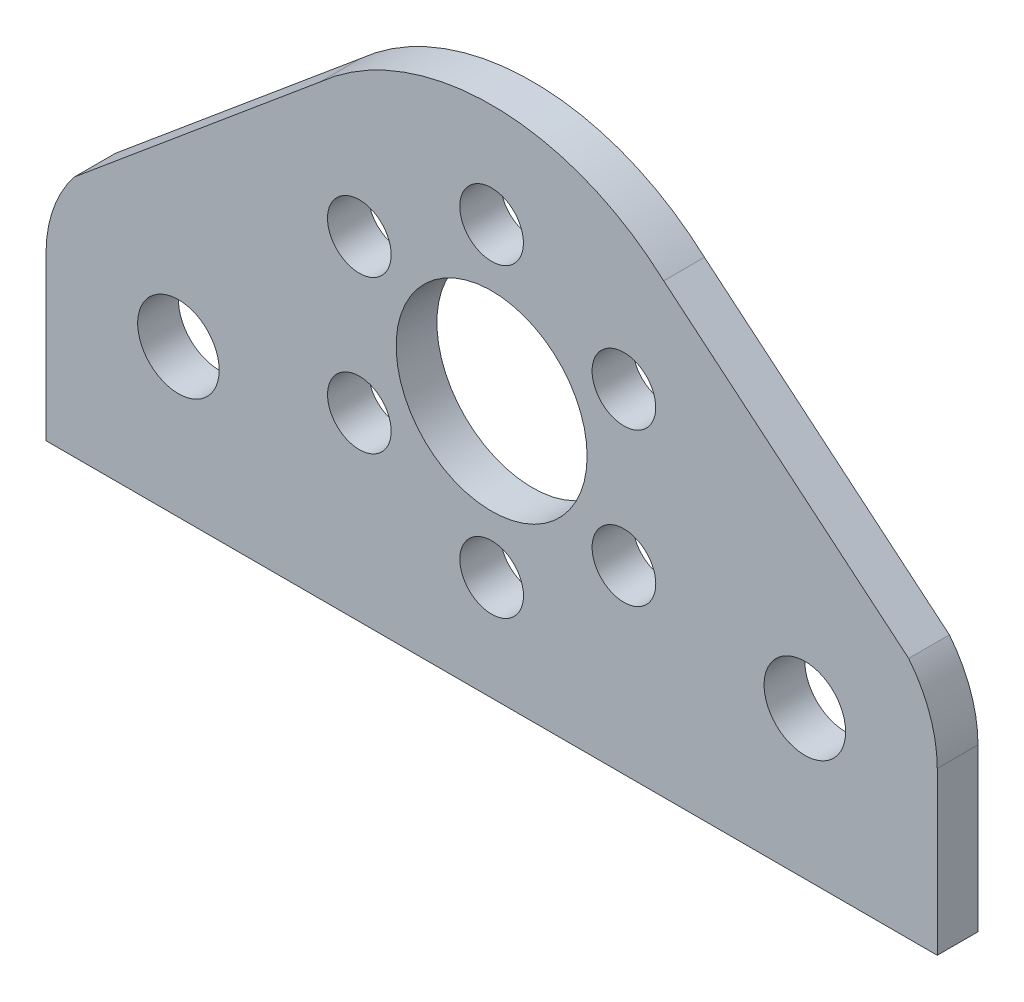
ISO-10303-21;
HEADER;
FILE_DESCRIPTION(('STEP AP214'),'2;1');
FILE_NAME('part.step','',(''),(''),'','','');
FILE_SCHEMA(('AUTOMOTIVE_DESIGN { 1 0 10303 214 1 1 1 1 }'));
ENDSEC;
DATA;
#1=APPLICATION_CONTEXT('core data for automotive mechanical design processes');
#2=APPLICATION_PROTOCOL_DEFINITION('international standard','automotive_design',2000,#1);
#3=PRODUCT_CONTEXT('',#1,'mechanical');
#4=PRODUCT('Part','Part','',(#3));
#5=PRODUCT_RELATED_PRODUCT_CATEGORY('part','',(#4));
#6=PRODUCT_DEFINITION_FORMATION('','',#4);
#7=PRODUCT_DEFINITION_CONTEXT('part definition',#1,'design');
#8=PRODUCT_DEFINITION('design','',#6,#7);
#9=PRODUCT_DEFINITION_SHAPE('','',#8);
#10=(LENGTH_UNIT() NAMED_UNIT(*) SI_UNIT(.MILLI.,.METRE.));
#11=(NAMED_UNIT(*) PLANE_ANGLE_UNIT() SI_UNIT($,.RADIAN.));
#12=(NAMED_UNIT(*) SI_UNIT($,.STERADIAN.) SOLID_ANGLE_UNIT());
#13=UNCERTAINTY_MEASURE_WITH_UNIT(LENGTH_MEASURE(1.E-05),#10,'distance_accuracy_value','');
#14=(GEOMETRIC_REPRESENTATION_CONTEXT(3) GLOBAL_UNCERTAINTY_ASSIGNED_CONTEXT((#13)) GLOBAL_UNIT_ASSIGNED_CONTEXT((#10,
#11,#12)) REPRESENTATION_CONTEXT('',''));
#15=CARTESIAN_POINT('',(0.,0.,0.));
#16=DIRECTION('',(0.,0.,1.));
#17=DIRECTION('',(1.,0.,0.));
#18=AXIS2_PLACEMENT_3D('',#15,#16,#17);
#19=CARTESIAN_POINT('',(6.44819039646015,7.7245462907083,1.6));
#20=DIRECTION('',(-0.640833355674646,-0.767680018142177,0.));
#21=DIRECTION('',(0.767680018142177,-0.640833355674646,0.));
#22=AXIS2_PLACEMENT_3D('',#19,#20,#21);
#23=PLANE('',#22);
#24=DIRECTION('',(-0.767680018142177,0.640833355674646,0.));
#25=VECTOR('',#24,1.);
#26=CARTESIAN_POINT('',(6.44819039646015,7.7245462907083,0.));
#27=LINE('',#26,#25);
#28=CARTESIAN_POINT('',(16.3755062932759,-0.562441788510507,0.));
#29=VERTEX_POINT('',#28);
#30=CARTESIAN_POINT('',(6.75749648165924,7.46634801561394,0.));
#31=VERTEX_POINT('',#30);
#32=EDGE_CURVE('E160',#29,#31,#27,.T.);
#33=ORIENTED_EDGE('',*,*,#32,.T.);
#34=DIRECTION('',(0.,0.,-1.));
#35=VECTOR('',#34,1.);
#36=CARTESIAN_POINT('',(6.75749648165924,7.46634801561394,1.6));
#37=LINE('',#36,#35);
#38=CARTESIAN_POINT('',(6.75749648165924,7.46634801561394,1.6));
#39=VERTEX_POINT('',#38);
#40=EDGE_CURVE('E11',#39,#31,#37,.T.);
#41=ORIENTED_EDGE('',*,*,#40,.F.);
#42=DIRECTION('',(-0.767680018142177,0.640833355674646,0.));
#43=VECTOR('',#42,1.);
#44=CARTESIAN_POINT('',(6.44819039646015,7.7245462907083,1.6));
#45=LINE('',#44,#43);
#46=CARTESIAN_POINT('',(16.3755062932759,-0.562441788510507,1.6));
#47=VERTEX_POINT('',#46);
#48=EDGE_CURVE('E204',#47,#39,#45,.T.);
#49=ORIENTED_EDGE('',*,*,#48,.F.);
#50=DIRECTION('',(0.,0.,-1.));
#51=VECTOR('',#50,1.);
#52=CARTESIAN_POINT('',(16.3755062932759,-0.562441788510507,1.6));
#53=LINE('',#52,#51);
#54=EDGE_CURVE('E129',#47,#29,#53,.T.);
#55=ORIENTED_EDGE('',*,*,#54,.T.);
#56=EDGE_LOOP('',(#33,#41,#49,#55));
#57=FACE_BOUND('',#56,.T.);
#58=ADVANCED_FACE('F36',(#57),#23,.F.);
#59=CARTESIAN_POINT('',(0.,0.,1.6));
#60=DIRECTION('',(0.,0.,-1.));
#61=DIRECTION('',(-1.,0.,0.));
#62=AXIS2_PLACEMENT_3D('',#59,#60,#61);
#63=CYLINDRICAL_SURFACE('',#62,10.0702587548632);
#64=CARTESIAN_POINT('',(0.,0.,0.));
#65=DIRECTION('',(0.,0.,1.));
#66=DIRECTION('',(1.,0.,0.));
#67=AXIS2_PLACEMENT_3D('',#64,#65,#66);
#68=CIRCLE('',#67,10.0702587548632);
#69=CARTESIAN_POINT('',(-6.75749648165924,7.46634801561394,0.));
#70=VERTEX_POINT('',#69);
#71=EDGE_CURVE('E163',#31,#70,#68,.T.);
#72=ORIENTED_EDGE('',*,*,#71,.T.);
#73=DIRECTION('',(0.,0.,-1.));
#74=VECTOR('',#73,1.);
#75=CARTESIAN_POINT('',(-6.75749648165924,7.46634801561394,1.6));
#76=LINE('',#75,#74);
#77=CARTESIAN_POINT('',(-6.75749648165924,7.46634801561394,1.6));
#78=VERTEX_POINT('',#77);
#79=EDGE_CURVE('E45',#78,#70,#76,.T.);
#80=ORIENTED_EDGE('',*,*,#79,.F.);
#81=CARTESIAN_POINT('',(0.,0.,1.6));
#82=DIRECTION('',(0.,0.,1.));
#83=DIRECTION('',(1.,0.,0.));
#84=AXIS2_PLACEMENT_3D('',#81,#82,#83);
#85=CIRCLE('',#84,10.0702587548632);
#86=EDGE_CURVE('E96',#39,#78,#85,.T.);
#87=ORIENTED_EDGE('',*,*,#86,.F.);
#88=ORIENTED_EDGE('',*,*,#40,.T.);
#89=EDGE_LOOP('',(#72,#80,#87,#88));
#90=FACE_BOUND('',#89,.T.);
#91=ADVANCED_FACE('F191',(#90),#63,.T.);
#92=CARTESIAN_POINT('',(-6.44819039646015,7.7245462907083,1.6));
#93=DIRECTION('',(-0.640833355674646,0.767680018142177,0.));
#94=DIRECTION('',(-0.767680018142177,-0.640833355674646,0.));
#95=AXIS2_PLACEMENT_3D('',#92,#93,#94);
#96=PLANE('',#95);
#97=DIRECTION('',(0.767680018142177,0.640833355674646,0.));
#98=VECTOR('',#97,1.);
#99=CARTESIAN_POINT('',(-6.44819039646015,7.7245462907083,0.));
#100=LINE('',#99,#98);
#101=CARTESIAN_POINT('',(-16.3755062932759,-0.562441788510509,0.));
#102=VERTEX_POINT('',#101);
#103=EDGE_CURVE('E166',#102,#70,#100,.T.);
#104=ORIENTED_EDGE('',*,*,#103,.F.);
#105=DIRECTION('',(0.,0.,-1.));
#106=VECTOR('',#105,1.);
#107=CARTESIAN_POINT('',(-16.3755062932759,-0.562441788510509,1.6));
#108=LINE('',#107,#106);
#109=CARTESIAN_POINT('',(-16.3755062932759,-0.562441788510509,1.6));
#110=VERTEX_POINT('',#109);
#111=EDGE_CURVE('E184',#110,#102,#108,.T.);
#112=ORIENTED_EDGE('',*,*,#111,.F.);
#113=DIRECTION('',(0.767680018142177,0.640833355674646,0.));
#114=VECTOR('',#113,1.);
#115=CARTESIAN_POINT('',(-6.44819039646015,7.7245462907083,1.6));
#116=LINE('',#115,#114);
#117=EDGE_CURVE('E190',#110,#78,#116,.T.);
#118=ORIENTED_EDGE('',*,*,#117,.T.);
#119=ORIENTED_EDGE('',*,*,#79,.T.);
#120=EDGE_LOOP('',(#104,#112,#118,#119));
#121=FACE_BOUND('',#120,.T.);
#122=ADVANCED_FACE('F188',(#121),#96,.T.);
#123=CARTESIAN_POINT('',(-12.436827991806,-3.74403321766813,1.6));
#124=DIRECTION('',(0.,0.,-1.));
#125=DIRECTION('',(-1.,0.,0.));
#126=AXIS2_PLACEMENT_3D('',#123,#124,#125);
#127=CYLINDRICAL_SURFACE('',#126,5.06317200819395);
#128=CARTESIAN_POINT('',(-12.436827991806,-3.74403321766813,0.));
#129=DIRECTION('',(0.,0.,1.));
#130=DIRECTION('',(1.,0.,0.));
#131=AXIS2_PLACEMENT_3D('',#128,#129,#130);
#132=CIRCLE('',#131,5.06317200819395);
#133=CARTESIAN_POINT('',(-17.5,-3.74403321766813,0.));
#134=VERTEX_POINT('',#133);
#135=EDGE_CURVE('E169',#134,#102,#132,.F.);
#136=ORIENTED_EDGE('',*,*,#135,.F.);
#137=DIRECTION('',(0.,0.,-1.));
#138=VECTOR('',#137,1.);
#139=CARTESIAN_POINT('',(-17.5,-3.74403321766813,1.6));
#140=LINE('',#139,#138);
#141=CARTESIAN_POINT('',(-17.5,-3.74403321766813,1.6));
#142=VERTEX_POINT('',#141);
#143=EDGE_CURVE('E182',#142,#134,#140,.T.);
#144=ORIENTED_EDGE('',*,*,#143,.F.);
#145=CARTESIAN_POINT('',(-12.436827991806,-3.74403321766813,1.6));
#146=DIRECTION('',(0.,0.,1.));
#147=DIRECTION('',(1.,0.,0.));
#148=AXIS2_PLACEMENT_3D('',#145,#146,#147);
#149=CIRCLE('',#148,5.06317200819395);
#150=EDGE_CURVE('E201',#142,#110,#149,.F.);
#151=ORIENTED_EDGE('',*,*,#150,.T.);
#152=ORIENTED_EDGE('',*,*,#111,.T.);
#153=EDGE_LOOP('',(#136,#144,#151,#152));
#154=FACE_BOUND('',#153,.T.);
#155=ADVANCED_FACE('F199',(#154),#127,.T.);
#156=CARTESIAN_POINT('',(-17.5,0.,1.6));
#157=DIRECTION('',(-1.,0.,0.));
#158=DIRECTION('',(0.,0.,1.));
#159=AXIS2_PLACEMENT_3D('',#156,#157,#158);
#160=PLANE('',#159);
#161=DIRECTION('',(0.,1.,0.));
#162=VECTOR('',#161,1.);
#163=CARTESIAN_POINT('',(-17.5,0.,0.));
#164=LINE('',#163,#162);
#165=CARTESIAN_POINT('',(-17.5,-10.1,0.));
#166=VERTEX_POINT('',#165);
#167=EDGE_CURVE('E172',#166,#134,#164,.T.);
#168=ORIENTED_EDGE('',*,*,#167,.F.);
#169=DIRECTION('',(0.,0.,-1.));
#170=VECTOR('',#169,1.);
#171=CARTESIAN_POINT('',(-17.5,-10.1,1.6));
#172=LINE('',#171,#170);
#173=CARTESIAN_POINT('',(-17.5,-10.1,1.6));
#174=VERTEX_POINT('',#173);
#175=EDGE_CURVE('E124',#174,#166,#172,.T.);
#176=ORIENTED_EDGE('',*,*,#175,.F.);
#177=DIRECTION('',(0.,1.,0.));
#178=VECTOR('',#177,1.);
#179=CARTESIAN_POINT('',(-17.5,0.,1.6));
#180=LINE('',#179,#178);
#181=EDGE_CURVE('E117',#174,#142,#180,.T.);
#182=ORIENTED_EDGE('',*,*,#181,.T.);
#183=ORIENTED_EDGE('',*,*,#143,.T.);
#184=EDGE_LOOP('',(#168,#176,#182,#183));
#185=FACE_BOUND('',#184,.T.);
#186=ADVANCED_FACE('F208',(#185),#160,.T.);
#187=CARTESIAN_POINT('',(0.,-10.1,1.6));
#188=DIRECTION('',(0.,1.,0.));
#189=DIRECTION('',(0.,0.,1.));
#190=AXIS2_PLACEMENT_3D('',#187,#188,#189);
#191=PLANE('',#190);
#192=DIRECTION('',(1.,0.,0.));
#193=VECTOR('',#192,1.);
#194=CARTESIAN_POINT('',(0.,-10.1,0.));
#195=LINE('',#194,#193);
#196=CARTESIAN_POINT('',(17.5,-10.1,0.));
#197=VERTEX_POINT('',#196);
#198=EDGE_CURVE('E123',#166,#197,#195,.T.);
#199=ORIENTED_EDGE('',*,*,#198,.T.);
#200=DIRECTION('',(0.,0.,-1.));
#201=VECTOR('',#200,1.);
#202=CARTESIAN_POINT('',(17.5,-10.1,1.6));
#203=LINE('',#202,#201);
#204=CARTESIAN_POINT('',(17.5,-10.1,1.6));
#205=VERTEX_POINT('',#204);
#206=EDGE_CURVE('E120',#205,#197,#203,.T.);
#207=ORIENTED_EDGE('',*,*,#206,.F.);
#208=DIRECTION('',(1.,0.,0.));
#209=VECTOR('',#208,1.);
#210=CARTESIAN_POINT('',(0.,-10.1,1.6));
#211=LINE('',#210,#209);
#212=EDGE_CURVE('E110',#174,#205,#211,.T.);
#213=ORIENTED_EDGE('',*,*,#212,.F.);
#214=ORIENTED_EDGE('',*,*,#175,.T.);
#215=EDGE_LOOP('',(#199,#207,#213,#214));
#216=FACE_BOUND('',#215,.T.);
#217=ADVANCED_FACE('F121',(#216),#191,.F.);
#218=CARTESIAN_POINT('',(17.5,0.,1.6));
#219=DIRECTION('',(-1.,0.,0.));
#220=DIRECTION('',(0.,0.,1.));
#221=AXIS2_PLACEMENT_3D('',#218,#219,#220);
#222=PLANE('',#221);
#223=DIRECTION('',(0.,1.,0.));
#224=VECTOR('',#223,1.);
#225=CARTESIAN_POINT('',(17.5,0.,0.));
#226=LINE('',#225,#224);
#227=CARTESIAN_POINT('',(17.5,-3.74403321766813,0.));
#228=VERTEX_POINT('',#227);
#229=EDGE_CURVE('E82',#197,#228,#226,.T.);
#230=ORIENTED_EDGE('',*,*,#229,.T.);
#231=DIRECTION('',(0.,0.,-1.));
#232=VECTOR('',#231,1.);
#233=CARTESIAN_POINT('',(17.5,-3.74403321766813,1.6));
#234=LINE('',#233,#232);
#235=CARTESIAN_POINT('',(17.5,-3.74403321766813,1.6));
#236=VERTEX_POINT('',#235);
#237=EDGE_CURVE('E125',#236,#228,#234,.T.);
#238=ORIENTED_EDGE('',*,*,#237,.F.);
#239=DIRECTION('',(0.,1.,0.));
#240=VECTOR('',#239,1.);
#241=CARTESIAN_POINT('',(17.5,0.,1.6));
#242=LINE('',#241,#240);
#243=EDGE_CURVE('E114',#205,#236,#242,.T.);
#244=ORIENTED_EDGE('',*,*,#243,.F.);
#245=ORIENTED_EDGE('',*,*,#206,.T.);
#246=EDGE_LOOP('',(#230,#238,#244,#245));
#247=FACE_BOUND('',#246,.T.);
#248=ADVANCED_FACE('F127',(#247),#222,.F.);
#249=CARTESIAN_POINT('',(0.,0.,1.6));
#250=DIRECTION('',(0.,0.,-1.));
#251=DIRECTION('',(-1.,0.,0.));
#252=AXIS2_PLACEMENT_3D('',#249,#250,#251);
#253=CYLINDRICAL_SURFACE('',#252,3.75);
#254=CARTESIAN_POINT('',(0.,0.,1.6));
#255=DIRECTION('',(0.,0.,1.));
#256=DIRECTION('',(1.,0.,0.));
#257=AXIS2_PLACEMENT_3D('',#254,#255,#256);
#258=CIRCLE('',#257,3.75);
#259=CARTESIAN_POINT('',(3.75,0.,1.6));
#260=VERTEX_POINT('',#259);
#261=EDGE_CURVE('E433',#260,#260,#258,.T.);
#262=ORIENTED_EDGE('',*,*,#261,.T.);
#263=EDGE_LOOP('',(#262));
#264=FACE_BOUND('',#263,.T.);
#265=CARTESIAN_POINT('',(0.,0.,0.));
#266=DIRECTION('',(0.,0.,1.));
#267=DIRECTION('',(1.,0.,0.));
#268=AXIS2_PLACEMENT_3D('',#265,#266,#267);
#269=CIRCLE('',#268,3.75);
#270=CARTESIAN_POINT('',(3.75,0.,0.));
#271=VERTEX_POINT('',#270);
#272=EDGE_CURVE('E157',#271,#271,#269,.T.);
#273=ORIENTED_EDGE('',*,*,#272,.F.);
#274=EDGE_LOOP('',(#273));
#275=FACE_BOUND('',#274,.T.);
#276=ADVANCED_FACE('F232',(#264,#275),#253,.F.);
#277=CARTESIAN_POINT('',(-0.00119999997012094,5.99880001037141,1.6));
#278=DIRECTION('',(0.,0.,-1.));
#279=DIRECTION('',(-1.,0.,0.));
#280=AXIS2_PLACEMENT_3D('',#277,#278,#279);
#281=CYLINDRICAL_SURFACE('',#280,1.24999999706816);
#282=CARTESIAN_POINT('',(-0.00119999997012094,5.99880001037141,1.6));
#283=DIRECTION('',(0.,0.,1.));
#284=DIRECTION('',(1.,0.,0.));
#285=AXIS2_PLACEMENT_3D('',#282,#283,#284);
#286=CIRCLE('',#285,1.24999999706816);
#287=CARTESIAN_POINT('',(1.24879999709804,5.99880001037141,1.6));
#288=VERTEX_POINT('',#287);
#289=EDGE_CURVE('E430',#288,#288,#286,.T.);
#290=ORIENTED_EDGE('',*,*,#289,.T.);
#291=EDGE_LOOP('',(#290));
#292=FACE_BOUND('',#291,.T.);
#293=CARTESIAN_POINT('',(-0.00119999997012094,5.99880001037141,0.));
#294=DIRECTION('',(0.,0.,1.));
#295=DIRECTION('',(1.,0.,0.));
#296=AXIS2_PLACEMENT_3D('',#293,#294,#295);
#297=CIRCLE('',#296,1.24999999706816);
#298=CARTESIAN_POINT('',(1.24879999709804,5.99880001037141,0.));
#299=VERTEX_POINT('',#298);
#300=EDGE_CURVE('E154',#299,#299,#297,.T.);
#301=ORIENTED_EDGE('',*,*,#300,.F.);
#302=EDGE_LOOP('',(#301));
#303=FACE_BOUND('',#302,.T.);
#304=ADVANCED_FACE('F235',(#292,#303),#281,.F.);
#305=CARTESIAN_POINT('',(5.1945131922217,3.00043923092804,1.6));
#306=DIRECTION('',(0.,0.,-1.));
#307=DIRECTION('',(-1.,0.,0.));
#308=AXIS2_PLACEMENT_3D('',#305,#306,#307);
#309=CYLINDRICAL_SURFACE('',#308,1.25000000000009);
#310=CARTESIAN_POINT('',(5.1945131922217,3.00043923092804,1.6));
#311=DIRECTION('',(0.,0.,1.));
#312=DIRECTION('',(1.,0.,0.));
#313=AXIS2_PLACEMENT_3D('',#310,#311,#312);
#314=CIRCLE('',#313,1.25000000000009);
#315=CARTESIAN_POINT('',(6.44451319222179,3.00043923092804,1.6));
#316=VERTEX_POINT('',#315);
#317=EDGE_CURVE('E427',#316,#316,#314,.T.);
#318=ORIENTED_EDGE('',*,*,#317,.T.);
#319=EDGE_LOOP('',(#318));
#320=FACE_BOUND('',#319,.T.);
#321=CARTESIAN_POINT('',(5.1945131922217,3.00043923092804,0.));
#322=DIRECTION('',(0.,0.,1.));
#323=DIRECTION('',(1.,0.,0.));
#324=AXIS2_PLACEMENT_3D('',#321,#322,#323);
#325=CIRCLE('',#324,1.25000000000009);
#326=CARTESIAN_POINT('',(6.44451319222179,3.00043923092804,0.));
#327=VERTEX_POINT('',#326);
#328=EDGE_CURVE('E151',#327,#327,#325,.T.);
#329=ORIENTED_EDGE('',*,*,#328,.F.);
#330=EDGE_LOOP('',(#329));
#331=FACE_BOUND('',#330,.T.);
#332=ADVANCED_FACE('F239',(#320,#331),#309,.F.);
#333=CARTESIAN_POINT('',(5.19571319222205,-2.99836076907197,1.6));
#334=DIRECTION('',(0.,0.,-1.));
#335=DIRECTION('',(-1.,0.,0.));
#336=AXIS2_PLACEMENT_3D('',#333,#334,#335);
#337=CYLINDRICAL_SURFACE('',#336,1.25000000000043);
#338=CARTESIAN_POINT('',(5.19571319222205,-2.99836076907197,1.6));
#339=DIRECTION('',(0.,0.,1.));
#340=DIRECTION('',(1.,0.,0.));
#341=AXIS2_PLACEMENT_3D('',#338,#339,#340);
#342=CIRCLE('',#341,1.25000000000043);
#343=CARTESIAN_POINT('',(6.44571319222248,-2.99836076907197,1.6));
#344=VERTEX_POINT('',#343);
#345=EDGE_CURVE('E424',#344,#344,#342,.T.);
#346=ORIENTED_EDGE('',*,*,#345,.T.);
#347=EDGE_LOOP('',(#346));
#348=FACE_BOUND('',#347,.T.);
#349=CARTESIAN_POINT('',(5.19571319222205,-2.99836076907197,0.));
#350=DIRECTION('',(0.,0.,1.));
#351=DIRECTION('',(1.,0.,0.));
#352=AXIS2_PLACEMENT_3D('',#349,#350,#351);
#353=CIRCLE('',#352,1.25000000000043);
#354=CARTESIAN_POINT('',(6.44571319222248,-2.99836076907197,0.));
#355=VERTEX_POINT('',#354);
#356=EDGE_CURVE('E148',#355,#355,#353,.T.);
#357=ORIENTED_EDGE('',*,*,#356,.F.);
#358=EDGE_LOOP('',(#357));
#359=FACE_BOUND('',#358,.T.);
#360=ADVANCED_FACE('F243',(#348,#359),#337,.F.);
#361=CARTESIAN_POINT('',(0.00120000000012124,-5.99879999955681,1.6));
#362=DIRECTION('',(0.,0.,-1.));
#363=DIRECTION('',(-1.,0.,0.));
#364=AXIS2_PLACEMENT_3D('',#361,#362,#363);
#365=CYLINDRICAL_SURFACE('',#364,1.25000000000069);
#366=CARTESIAN_POINT('',(0.00120000000012124,-5.99879999955681,1.6));
#367=DIRECTION('',(0.,0.,1.));
#368=DIRECTION('',(1.,0.,0.));
#369=AXIS2_PLACEMENT_3D('',#366,#367,#368);
#370=CIRCLE('',#369,1.25000000000069);
#371=CARTESIAN_POINT('',(1.25120000000082,-5.99879999955681,1.6));
#372=VERTEX_POINT('',#371);
#373=EDGE_CURVE('E421',#372,#372,#370,.T.);
#374=ORIENTED_EDGE('',*,*,#373,.T.);
#375=EDGE_LOOP('',(#374));
#376=FACE_BOUND('',#375,.T.);
#377=CARTESIAN_POINT('',(0.00120000000012124,-5.99879999955681,0.));
#378=DIRECTION('',(0.,0.,1.));
#379=DIRECTION('',(1.,0.,0.));
#380=AXIS2_PLACEMENT_3D('',#377,#378,#379);
#381=CIRCLE('',#380,1.25000000000069);
#382=CARTESIAN_POINT('',(1.25120000000082,-5.99879999955681,0.));
#383=VERTEX_POINT('',#382);
#384=EDGE_CURVE('E145',#383,#383,#381,.T.);
#385=ORIENTED_EDGE('',*,*,#384,.F.);
#386=EDGE_LOOP('',(#385));
#387=FACE_BOUND('',#386,.T.);
#388=ADVANCED_FACE('F247',(#376,#387),#365,.F.);
#389=CARTESIAN_POINT('',(-5.19451319222214,-3.00043923004164,1.6));
#390=DIRECTION('',(0.,0.,-1.));
#391=DIRECTION('',(-1.,0.,0.));
#392=AXIS2_PLACEMENT_3D('',#389,#390,#391);
#393=CYLINDRICAL_SURFACE('',#392,1.25000000000063);
#394=CARTESIAN_POINT('',(-5.19451319222214,-3.00043923004164,1.6));
#395=DIRECTION('',(0.,0.,1.));
#396=DIRECTION('',(1.,0.,0.));
#397=AXIS2_PLACEMENT_3D('',#394,#395,#396);
#398=CIRCLE('',#397,1.25000000000063);
#399=CARTESIAN_POINT('',(-3.94451319222151,-3.00043923004164,1.6));
#400=VERTEX_POINT('',#399);
#401=EDGE_CURVE('E414',#400,#400,#398,.T.);
#402=ORIENTED_EDGE('',*,*,#401,.T.);
#403=EDGE_LOOP('',(#402));
#404=FACE_BOUND('',#403,.T.);
#405=CARTESIAN_POINT('',(-5.19451319222214,-3.00043923004164,0.));
#406=DIRECTION('',(0.,0.,1.));
#407=DIRECTION('',(1.,0.,0.));
#408=AXIS2_PLACEMENT_3D('',#405,#406,#407);
#409=CIRCLE('',#408,1.25000000000063);
#410=CARTESIAN_POINT('',(-3.94451319222151,-3.00043923004164,0.));
#411=VERTEX_POINT('',#410);
#412=EDGE_CURVE('E142',#411,#411,#409,.T.);
#413=ORIENTED_EDGE('',*,*,#412,.F.);
#414=EDGE_LOOP('',(#413));
#415=FACE_BOUND('',#414,.T.);
#416=ADVANCED_FACE('F251',(#404,#415),#393,.F.);
#417=CARTESIAN_POINT('',(-5.19571324784459,2.99836080206472,1.6));
#418=DIRECTION('',(0.,0.,-1.));
#419=DIRECTION('',(-1.,0.,0.));
#420=AXIS2_PLACEMENT_3D('',#417,#418,#419);
#421=CYLINDRICAL_SURFACE('',#420,1.25000000660969);
#422=CARTESIAN_POINT('',(-5.19571324784459,2.99836080206472,1.6));
#423=DIRECTION('',(0.,0.,1.));
#424=DIRECTION('',(1.,0.,0.));
#425=AXIS2_PLACEMENT_3D('',#422,#423,#424);
#426=CIRCLE('',#425,1.25000000660969);
#427=CARTESIAN_POINT('',(-3.9457132412349,2.99836080206472,1.6));
#428=VERTEX_POINT('',#427);
#429=EDGE_CURVE('E411',#428,#428,#426,.T.);
#430=ORIENTED_EDGE('',*,*,#429,.T.);
#431=EDGE_LOOP('',(#430));
#432=FACE_BOUND('',#431,.T.);
#433=CARTESIAN_POINT('',(-5.19571324784459,2.99836080206472,0.));
#434=DIRECTION('',(0.,0.,1.));
#435=DIRECTION('',(1.,0.,0.));
#436=AXIS2_PLACEMENT_3D('',#433,#434,#435);
#437=CIRCLE('',#436,1.25000000660969);
#438=CARTESIAN_POINT('',(-3.9457132412349,2.99836080206472,0.));
#439=VERTEX_POINT('',#438);
#440=EDGE_CURVE('E139',#439,#439,#437,.T.);
#441=ORIENTED_EDGE('',*,*,#440,.F.);
#442=EDGE_LOOP('',(#441));
#443=FACE_BOUND('',#442,.T.);
#444=ADVANCED_FACE('F255',(#432,#443),#421,.F.);
#445=CARTESIAN_POINT('',(12.3,-4.3,1.6));
#446=DIRECTION('',(0.,0.,-1.));
#447=DIRECTION('',(-1.,0.,0.));
#448=AXIS2_PLACEMENT_3D('',#445,#446,#447);
#449=CYLINDRICAL_SURFACE('',#448,1.6);
#450=CARTESIAN_POINT('',(12.3,-4.3,1.6));
#451=DIRECTION('',(0.,0.,1.));
#452=DIRECTION('',(1.,0.,0.));
#453=AXIS2_PLACEMENT_3D('',#450,#451,#452);
#454=CIRCLE('',#453,1.6);
#455=CARTESIAN_POINT('',(13.9,-4.3,1.6));
#456=VERTEX_POINT('',#455);
#457=EDGE_CURVE('E266',#456,#456,#454,.T.);
#458=ORIENTED_EDGE('',*,*,#457,.T.);
#459=EDGE_LOOP('',(#458));
#460=FACE_BOUND('',#459,.T.);
#461=CARTESIAN_POINT('',(12.3,-4.3,0.));
#462=DIRECTION('',(0.,0.,1.));
#463=DIRECTION('',(1.,0.,0.));
#464=AXIS2_PLACEMENT_3D('',#461,#462,#463);
#465=CIRCLE('',#464,1.6);
#466=CARTESIAN_POINT('',(13.9,-4.3,0.));
#467=VERTEX_POINT('',#466);
#468=EDGE_CURVE('E136',#467,#467,#465,.T.);
#469=ORIENTED_EDGE('',*,*,#468,.F.);
#470=EDGE_LOOP('',(#469));
#471=FACE_BOUND('',#470,.T.);
#472=ADVANCED_FACE('F220',(#460,#471),#449,.F.);
#473=CARTESIAN_POINT('',(-12.3,-4.3,1.6));
#474=DIRECTION('',(0.,0.,-1.));
#475=DIRECTION('',(-1.,0.,0.));
#476=AXIS2_PLACEMENT_3D('',#473,#474,#475);
#477=CYLINDRICAL_SURFACE('',#476,1.6);
#478=CARTESIAN_POINT('',(-12.3,-4.3,1.6));
#479=DIRECTION('',(0.,0.,1.));
#480=DIRECTION('',(1.,0.,0.));
#481=AXIS2_PLACEMENT_3D('',#478,#479,#480);
#482=CIRCLE('',#481,1.6);
#483=CARTESIAN_POINT('',(-10.7,-4.3,1.6));
#484=VERTEX_POINT('',#483);
#485=EDGE_CURVE('E178',#484,#484,#482,.F.);
#486=ORIENTED_EDGE('',*,*,#485,.F.);
#487=EDGE_LOOP('',(#486));
#488=FACE_BOUND('',#487,.T.);
#489=CARTESIAN_POINT('',(-12.3,-4.3,0.));
#490=DIRECTION('',(0.,0.,1.));
#491=DIRECTION('',(1.,0.,0.));
#492=AXIS2_PLACEMENT_3D('',#489,#490,#491);
#493=CIRCLE('',#492,1.6);
#494=CARTESIAN_POINT('',(-10.7,-4.3,0.));
#495=VERTEX_POINT('',#494);
#496=EDGE_CURVE('E133',#495,#495,#493,.F.);
#497=ORIENTED_EDGE('',*,*,#496,.T.);
#498=EDGE_LOOP('',(#497));
#499=FACE_BOUND('',#498,.T.);
#500=ADVANCED_FACE('F38',(#488,#499),#477,.F.);
#501=CARTESIAN_POINT('',(12.436827991806,-3.74403321766813,1.6));
#502=DIRECTION('',(0.,0.,-1.));
#503=DIRECTION('',(-1.,0.,0.));
#504=AXIS2_PLACEMENT_3D('',#501,#502,#503);
#505=CYLINDRICAL_SURFACE('',#504,5.06317200819395);
#506=CARTESIAN_POINT('',(12.436827991806,-3.74403321766813,0.));
#507=DIRECTION('',(0.,0.,1.));
#508=DIRECTION('',(1.,0.,0.));
#509=AXIS2_PLACEMENT_3D('',#506,#507,#508);
#510=CIRCLE('',#509,5.06317200819395);
#511=EDGE_CURVE('E88',#228,#29,#510,.T.);
#512=ORIENTED_EDGE('',*,*,#511,.T.);
#513=ORIENTED_EDGE('',*,*,#54,.F.);
#514=CARTESIAN_POINT('',(12.436827991806,-3.74403321766813,1.6));
#515=DIRECTION('',(0.,0.,1.));
#516=DIRECTION('',(1.,0.,0.));
#517=AXIS2_PLACEMENT_3D('',#514,#515,#516);
#518=CIRCLE('',#517,5.06317200819395);
#519=EDGE_CURVE('E53',#236,#47,#518,.T.);
#520=ORIENTED_EDGE('',*,*,#519,.F.);
#521=ORIENTED_EDGE('',*,*,#237,.T.);
#522=EDGE_LOOP('',(#512,#513,#520,#521));
#523=FACE_BOUND('',#522,.T.);
#524=ADVANCED_FACE('F211',(#523),#505,.T.);
#525=CARTESIAN_POINT('',(0.,0.,1.6));
#526=DIRECTION('',(0.,0.,1.));
#527=DIRECTION('',(1.,0.,0.));
#528=AXIS2_PLACEMENT_3D('',#525,#526,#527);
#529=PLANE('',#528);
#530=ORIENTED_EDGE('',*,*,#485,.T.);
#531=EDGE_LOOP('',(#530));
#532=FACE_BOUND('',#531,.T.);
#533=ORIENTED_EDGE('',*,*,#457,.F.);
#534=EDGE_LOOP('',(#533));
#535=FACE_BOUND('',#534,.T.);
#536=ORIENTED_EDGE('',*,*,#429,.F.);
#537=EDGE_LOOP('',(#536));
#538=FACE_BOUND('',#537,.T.);
#539=ORIENTED_EDGE('',*,*,#401,.F.);
#540=EDGE_LOOP('',(#539));
#541=FACE_BOUND('',#540,.T.);
#542=ORIENTED_EDGE('',*,*,#373,.F.);
#543=EDGE_LOOP('',(#542));
#544=FACE_BOUND('',#543,.T.);
#545=ORIENTED_EDGE('',*,*,#345,.F.);
#546=EDGE_LOOP('',(#545));
#547=FACE_BOUND('',#546,.T.);
#548=ORIENTED_EDGE('',*,*,#317,.F.);
#549=EDGE_LOOP('',(#548));
#550=FACE_BOUND('',#549,.T.);
#551=ORIENTED_EDGE('',*,*,#289,.F.);
#552=EDGE_LOOP('',(#551));
#553=FACE_BOUND('',#552,.T.);
#554=ORIENTED_EDGE('',*,*,#261,.F.);
#555=EDGE_LOOP('',(#554));
#556=FACE_BOUND('',#555,.T.);
#557=ORIENTED_EDGE('',*,*,#48,.T.);
#558=ORIENTED_EDGE('',*,*,#86,.T.);
#559=ORIENTED_EDGE('',*,*,#117,.F.);
#560=ORIENTED_EDGE('',*,*,#150,.F.);
#561=ORIENTED_EDGE('',*,*,#181,.F.);
#562=ORIENTED_EDGE('',*,*,#212,.T.);
#563=ORIENTED_EDGE('',*,*,#243,.T.);
#564=ORIENTED_EDGE('',*,*,#519,.T.);
#565=EDGE_LOOP('',(#557,#558,#559,#560,#561,#562,#563,#564));
#566=FACE_BOUND('',#565,.T.);
#567=ADVANCED_FACE('F112',(#532,#535,#538,#541,#544,#547,#550,#553,#556,#566),#529,.T.);
#568=CARTESIAN_POINT('',(0.,0.,0.));
#569=DIRECTION('',(0.,0.,1.));
#570=DIRECTION('',(1.,0.,0.));
#571=AXIS2_PLACEMENT_3D('',#568,#569,#570);
#572=PLANE('',#571);
#573=ORIENTED_EDGE('',*,*,#496,.F.);
#574=EDGE_LOOP('',(#573));
#575=FACE_BOUND('',#574,.T.);
#576=ORIENTED_EDGE('',*,*,#468,.T.);
#577=EDGE_LOOP('',(#576));
#578=FACE_BOUND('',#577,.T.);
#579=ORIENTED_EDGE('',*,*,#440,.T.);
#580=EDGE_LOOP('',(#579));
#581=FACE_BOUND('',#580,.T.);
#582=ORIENTED_EDGE('',*,*,#412,.T.);
#583=EDGE_LOOP('',(#582));
#584=FACE_BOUND('',#583,.T.);
#585=ORIENTED_EDGE('',*,*,#384,.T.);
#586=EDGE_LOOP('',(#585));
#587=FACE_BOUND('',#586,.T.);
#588=ORIENTED_EDGE('',*,*,#356,.T.);
#589=EDGE_LOOP('',(#588));
#590=FACE_BOUND('',#589,.T.);
#591=ORIENTED_EDGE('',*,*,#328,.T.);
#592=EDGE_LOOP('',(#591));
#593=FACE_BOUND('',#592,.T.);
#594=ORIENTED_EDGE('',*,*,#300,.T.);
#595=EDGE_LOOP('',(#594));
#596=FACE_BOUND('',#595,.T.);
#597=ORIENTED_EDGE('',*,*,#272,.T.);
#598=EDGE_LOOP('',(#597));
#599=FACE_BOUND('',#598,.T.);
#600=ORIENTED_EDGE('',*,*,#32,.F.);
#601=ORIENTED_EDGE('',*,*,#511,.F.);
#602=ORIENTED_EDGE('',*,*,#229,.F.);
#603=ORIENTED_EDGE('',*,*,#198,.F.);
#604=ORIENTED_EDGE('',*,*,#167,.T.);
#605=ORIENTED_EDGE('',*,*,#135,.T.);
#606=ORIENTED_EDGE('',*,*,#103,.T.);
#607=ORIENTED_EDGE('',*,*,#71,.F.);
#608=EDGE_LOOP('',(#600,#601,#602,#603,#604,#605,#606,#607));
#609=FACE_BOUND('',#608,.T.);
#610=ADVANCED_FACE('F195',(#575,#578,#581,#584,#587,#590,#593,#596,#599,#609),#572,.F.);
#611=CLOSED_SHELL('',(#58,#91,#122,#155,#186,#217,#248,#276,#304,#332,#360,#388,#416,#444,#472,
#500,#524,#567,#610));
#612=MANIFOLD_SOLID_BREP('B2',#611);
#613=ADVANCED_BREP_SHAPE_REPRESENTATION('',(#18,#612),#14);
#614=SHAPE_DEFINITION_REPRESENTATION(#9,#613);
ENDSEC;
END-ISO-10303-21;
